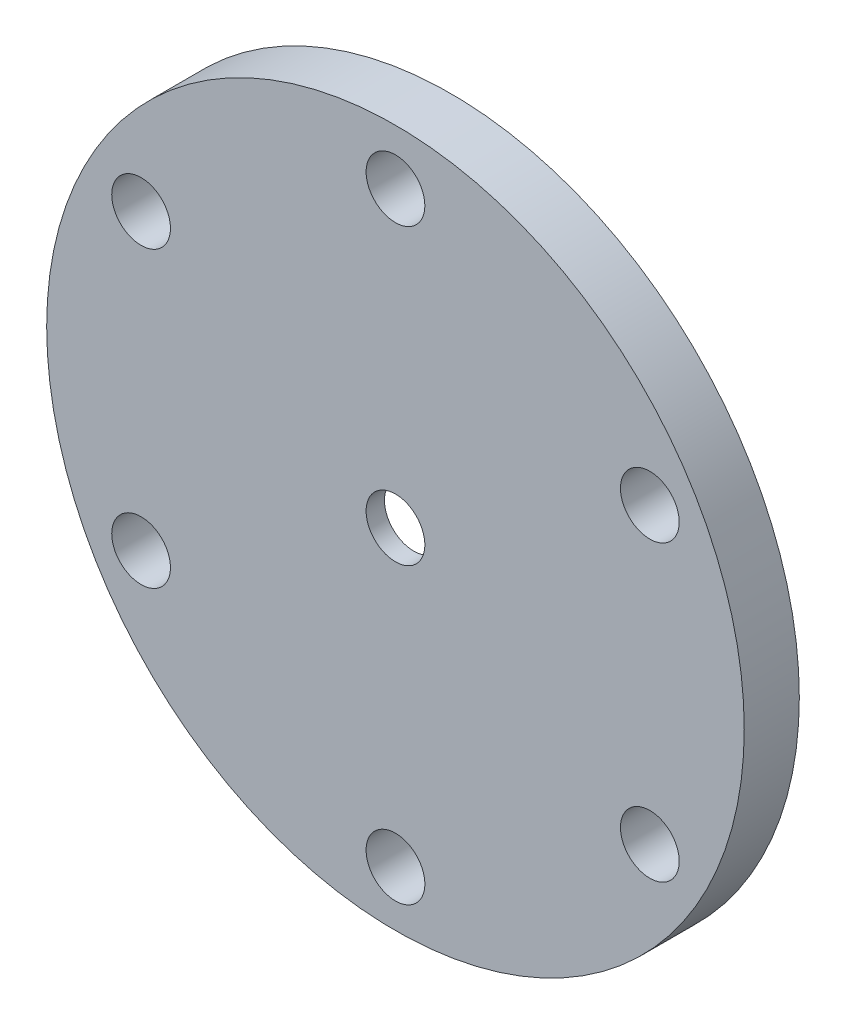
ISO-10303-21;
HEADER;
FILE_DESCRIPTION(('STEP AP214'),'2;1');
FILE_NAME('part.step','',(''),(''),'','','');
FILE_SCHEMA(('AUTOMOTIVE_DESIGN { 1 0 10303 214 1 1 1 1 }'));
ENDSEC;
DATA;
#1=APPLICATION_CONTEXT('core data for automotive mechanical design processes');
#2=APPLICATION_PROTOCOL_DEFINITION('international standard','automotive_design',2000,#1);
#3=PRODUCT_CONTEXT('',#1,'mechanical');
#4=PRODUCT('Part','Part','',(#3));
#5=PRODUCT_RELATED_PRODUCT_CATEGORY('part','',(#4));
#6=PRODUCT_DEFINITION_FORMATION('','',#4);
#7=PRODUCT_DEFINITION_CONTEXT('part definition',#1,'design');
#8=PRODUCT_DEFINITION('design','',#6,#7);
#9=PRODUCT_DEFINITION_SHAPE('','',#8);
#10=(LENGTH_UNIT() NAMED_UNIT(*) SI_UNIT(.MILLI.,.METRE.));
#11=(NAMED_UNIT(*) PLANE_ANGLE_UNIT() SI_UNIT($,.RADIAN.));
#12=(NAMED_UNIT(*) SI_UNIT($,.STERADIAN.) SOLID_ANGLE_UNIT());
#13=UNCERTAINTY_MEASURE_WITH_UNIT(LENGTH_MEASURE(1.E-05),#10,'distance_accuracy_value','');
#14=(GEOMETRIC_REPRESENTATION_CONTEXT(3) GLOBAL_UNCERTAINTY_ASSIGNED_CONTEXT((#13)) GLOBAL_UNIT_ASSIGNED_CONTEXT((#10,
#11,#12)) REPRESENTATION_CONTEXT('',''));
#15=CARTESIAN_POINT('',(0.,0.,0.));
#16=DIRECTION('',(0.,0.,1.));
#17=DIRECTION('',(1.,0.,0.));
#18=AXIS2_PLACEMENT_3D('',#15,#16,#17);
#19=CARTESIAN_POINT('',(0.,0.,83.1));
#20=DIRECTION('',(0.,0.,-1.));
#21=DIRECTION('',(1.,0.,0.));
#22=AXIS2_PLACEMENT_3D('',#19,#20,#21);
#23=CYLINDRICAL_SURFACE('',#22,12.);
#24=CARTESIAN_POINT('',(0.,0.,81.1));
#25=DIRECTION('',(0.,0.,1.));
#26=DIRECTION('',(1.,0.,0.));
#27=AXIS2_PLACEMENT_3D('',#24,#25,#26);
#28=CIRCLE('',#27,12.);
#29=CARTESIAN_POINT('',(-12.,0.,81.1));
#30=VERTEX_POINT('',#29);
#31=EDGE_CURVE('E40',#30,#30,#28,.T.);
#32=ORIENTED_EDGE('',*,*,#31,.F.);
#33=DIRECTION('',(0.,0.,1.));
#34=VECTOR('',#33,1.);
#35=CARTESIAN_POINT('',(-12.,0.,83.1));
#36=LINE('',#35,#34);
#37=CARTESIAN_POINT('',(-12.,0.,83.1));
#38=VERTEX_POINT('',#37);
#39=EDGE_CURVE('E11',#30,#38,#36,.T.);
#40=ORIENTED_EDGE('',*,*,#39,.T.);
#41=CARTESIAN_POINT('',(0.,0.,83.1));
#42=DIRECTION('',(0.,0.,-1.));
#43=DIRECTION('',(1.,0.,0.));
#44=AXIS2_PLACEMENT_3D('',#41,#42,#43);
#45=CIRCLE('',#44,12.);
#46=EDGE_CURVE('E208',#38,#38,#45,.T.);
#47=ORIENTED_EDGE('',*,*,#46,.F.);
#48=ORIENTED_EDGE('',*,*,#39,.F.);
#49=EDGE_LOOP('',(#32,#40,#47,#48));
#50=FACE_BOUND('',#49,.T.);
#51=ADVANCED_FACE('F16',(#50),#23,.F.);
#52=CARTESIAN_POINT('',(0.,0.,81.1));
#53=DIRECTION('',(0.,0.,1.));
#54=DIRECTION('',(1.,0.,0.));
#55=AXIS2_PLACEMENT_3D('',#52,#53,#54);
#56=PLANE('',#55);
#57=CARTESIAN_POINT('',(0.,0.,81.1));
#58=DIRECTION('',(0.,0.,-1.));
#59=DIRECTION('',(1.,0.,0.));
#60=AXIS2_PLACEMENT_3D('',#57,#58,#59);
#61=CIRCLE('',#60,19.);
#62=CARTESIAN_POINT('',(-19.,0.,81.1));
#63=VERTEX_POINT('',#62);
#64=EDGE_CURVE('E27',#63,#63,#61,.T.);
#65=ORIENTED_EDGE('',*,*,#64,.T.);
#66=EDGE_LOOP('',(#65));
#67=FACE_BOUND('',#66,.T.);
#68=CARTESIAN_POINT('',(-13.8564066670276,-8.00000011920929,81.1));
#69=DIRECTION('',(0.,0.,1.));
#70=DIRECTION('',(1.,0.,0.));
#71=AXIS2_PLACEMENT_3D('',#68,#69,#70);
#72=CIRCLE('',#71,1.6);
#73=CARTESIAN_POINT('',(-15.4564066670276,-8.00000011920929,81.1));
#74=VERTEX_POINT('',#73);
#75=EDGE_CURVE('E176',#74,#74,#72,.T.);
#76=ORIENTED_EDGE('',*,*,#75,.T.);
#77=EDGE_LOOP('',(#76));
#78=FACE_BOUND('',#77,.T.);
#79=CARTESIAN_POINT('',(-13.8564066670276,8.00000011920929,81.1));
#80=DIRECTION('',(0.,0.,1.));
#81=DIRECTION('',(1.,0.,0.));
#82=AXIS2_PLACEMENT_3D('',#79,#80,#81);
#83=CIRCLE('',#82,1.6);
#84=CARTESIAN_POINT('',(-15.4564066670276,8.00000011920929,81.1));
#85=VERTEX_POINT('',#84);
#86=EDGE_CURVE('E180',#85,#85,#83,.T.);
#87=ORIENTED_EDGE('',*,*,#86,.T.);
#88=EDGE_LOOP('',(#87));
#89=FACE_BOUND('',#88,.T.);
#90=CARTESIAN_POINT('',(13.8564066670276,8.00000011920929,81.1));
#91=DIRECTION('',(0.,0.,1.));
#92=DIRECTION('',(1.,0.,0.));
#93=AXIS2_PLACEMENT_3D('',#90,#91,#92);
#94=CIRCLE('',#93,1.6);
#95=CARTESIAN_POINT('',(12.2564066670276,8.00000011920929,81.1));
#96=VERTEX_POINT('',#95);
#97=EDGE_CURVE('E175',#96,#96,#94,.T.);
#98=ORIENTED_EDGE('',*,*,#97,.T.);
#99=EDGE_LOOP('',(#98));
#100=FACE_BOUND('',#99,.T.);
#101=CARTESIAN_POINT('',(13.8564066670276,-8.00000011920929,81.1));
#102=DIRECTION('',(0.,0.,1.));
#103=DIRECTION('',(1.,0.,0.));
#104=AXIS2_PLACEMENT_3D('',#101,#102,#103);
#105=CIRCLE('',#104,1.6);
#106=CARTESIAN_POINT('',(12.2564066670276,-8.00000011920929,81.1));
#107=VERTEX_POINT('',#106);
#108=EDGE_CURVE('E171',#107,#107,#105,.T.);
#109=ORIENTED_EDGE('',*,*,#108,.T.);
#110=EDGE_LOOP('',(#109));
#111=FACE_BOUND('',#110,.T.);
#112=ORIENTED_EDGE('',*,*,#31,.T.);
#113=EDGE_LOOP('',(#112));
#114=FACE_BOUND('',#113,.T.);
#115=CARTESIAN_POINT('',(0.,16.0000002384186,81.1));
#116=DIRECTION('',(0.,0.,1.));
#117=DIRECTION('',(1.,0.,0.));
#118=AXIS2_PLACEMENT_3D('',#115,#116,#117);
#119=CIRCLE('',#118,1.6);
#120=CARTESIAN_POINT('',(-1.6,16.0000002384186,81.1));
#121=VERTEX_POINT('',#120);
#122=EDGE_CURVE('E145',#121,#121,#119,.T.);
#123=ORIENTED_EDGE('',*,*,#122,.T.);
#124=EDGE_LOOP('',(#123));
#125=FACE_BOUND('',#124,.T.);
#126=CARTESIAN_POINT('',(0.,-16.0000002384186,81.1));
#127=DIRECTION('',(0.,0.,1.));
#128=DIRECTION('',(1.,0.,0.));
#129=AXIS2_PLACEMENT_3D('',#126,#127,#128);
#130=CIRCLE('',#129,1.6);
#131=CARTESIAN_POINT('',(-1.6,-16.0000002384186,81.1));
#132=VERTEX_POINT('',#131);
#133=EDGE_CURVE('E148',#132,#132,#130,.T.);
#134=ORIENTED_EDGE('',*,*,#133,.T.);
#135=EDGE_LOOP('',(#134));
#136=FACE_BOUND('',#135,.T.);
#137=ADVANCED_FACE('F219',(#67,#78,#89,#100,#111,#114,#125,#136),#56,.F.);
#138=CARTESIAN_POINT('',(-13.8564066670276,8.00000011920929,83.1));
#139=DIRECTION('',(0.,0.,1.));
#140=DIRECTION('',(1.,0.,0.));
#141=AXIS2_PLACEMENT_3D('',#138,#139,#140);
#142=CYLINDRICAL_SURFACE('',#141,1.6);
#143=CARTESIAN_POINT('',(-13.8564066670276,8.00000011920929,84.1));
#144=DIRECTION('',(0.,0.,-1.));
#145=DIRECTION('',(1.,0.,0.));
#146=AXIS2_PLACEMENT_3D('',#143,#144,#145);
#147=CIRCLE('',#146,1.6);
#148=CARTESIAN_POINT('',(-15.4564066670276,8.00000011920929,84.1));
#149=VERTEX_POINT('',#148);
#150=EDGE_CURVE('E114',#149,#149,#147,.T.);
#151=ORIENTED_EDGE('',*,*,#150,.F.);
#152=DIRECTION('',(0.,0.,-1.));
#153=VECTOR('',#152,1.);
#154=CARTESIAN_POINT('',(-15.4564066670276,8.00000011920929,83.1));
#155=LINE('',#154,#153);
#156=EDGE_CURVE('E144',#149,#85,#155,.T.);
#157=ORIENTED_EDGE('',*,*,#156,.T.);
#158=ORIENTED_EDGE('',*,*,#86,.F.);
#159=ORIENTED_EDGE('',*,*,#156,.F.);
#160=EDGE_LOOP('',(#151,#157,#158,#159));
#161=FACE_BOUND('',#160,.T.);
#162=ADVANCED_FACE('F221',(#161),#142,.F.);
#163=CARTESIAN_POINT('',(0.,16.0000002384186,83.1));
#164=DIRECTION('',(0.,0.,1.));
#165=DIRECTION('',(1.,0.,0.));
#166=AXIS2_PLACEMENT_3D('',#163,#164,#165);
#167=CYLINDRICAL_SURFACE('',#166,1.6);
#168=CARTESIAN_POINT('',(0.,16.0000002384186,84.1));
#169=DIRECTION('',(0.,0.,-1.));
#170=DIRECTION('',(1.,0.,0.));
#171=AXIS2_PLACEMENT_3D('',#168,#169,#170);
#172=CIRCLE('',#171,1.6);
#173=CARTESIAN_POINT('',(1.6,16.0000002384186,84.1));
#174=VERTEX_POINT('',#173);
#175=CARTESIAN_POINT('',(-1.6,16.0000002384186,84.1));
#176=VERTEX_POINT('',#175);
#177=EDGE_CURVE('E102',#174,#176,#172,.T.);
#178=ORIENTED_EDGE('',*,*,#177,.F.);
#179=CARTESIAN_POINT('',(0.,16.0000002384186,84.1));
#180=DIRECTION('',(0.,0.,-1.));
#181=DIRECTION('',(1.,0.,0.));
#182=AXIS2_PLACEMENT_3D('',#179,#180,#181);
#183=CIRCLE('',#182,1.6);
#184=EDGE_CURVE('E140',#176,#174,#183,.T.);
#185=ORIENTED_EDGE('',*,*,#184,.F.);
#186=DIRECTION('',(0.,0.,-1.));
#187=VECTOR('',#186,1.);
#188=CARTESIAN_POINT('',(-1.6,16.0000002384186,83.1));
#189=LINE('',#188,#187);
#190=EDGE_CURVE('E154',#176,#121,#189,.T.);
#191=ORIENTED_EDGE('',*,*,#190,.T.);
#192=ORIENTED_EDGE('',*,*,#122,.F.);
#193=ORIENTED_EDGE('',*,*,#190,.F.);
#194=EDGE_LOOP('',(#178,#185,#191,#192,#193));
#195=FACE_BOUND('',#194,.T.);
#196=ADVANCED_FACE('F227',(#195),#167,.F.);
#197=CARTESIAN_POINT('',(13.8564066670276,8.00000011920929,83.1));
#198=DIRECTION('',(0.,0.,1.));
#199=DIRECTION('',(1.,0.,0.));
#200=AXIS2_PLACEMENT_3D('',#197,#198,#199);
#201=CYLINDRICAL_SURFACE('',#200,1.6);
#202=CARTESIAN_POINT('',(13.8564066670276,8.00000011920929,84.1));
#203=DIRECTION('',(0.,0.,-1.));
#204=DIRECTION('',(1.,0.,0.));
#205=AXIS2_PLACEMENT_3D('',#202,#203,#204);
#206=CIRCLE('',#205,1.6);
#207=CARTESIAN_POINT('',(12.2564066670276,8.00000011920929,84.1));
#208=VERTEX_POINT('',#207);
#209=EDGE_CURVE('E125',#208,#208,#206,.T.);
#210=ORIENTED_EDGE('',*,*,#209,.F.);
#211=DIRECTION('',(0.,0.,-1.));
#212=VECTOR('',#211,1.);
#213=CARTESIAN_POINT('',(12.2564066670276,8.00000011920929,83.1));
#214=LINE('',#213,#212);
#215=EDGE_CURVE('E127',#208,#96,#214,.T.);
#216=ORIENTED_EDGE('',*,*,#215,.T.);
#217=ORIENTED_EDGE('',*,*,#97,.F.);
#218=ORIENTED_EDGE('',*,*,#215,.F.);
#219=EDGE_LOOP('',(#210,#216,#217,#218));
#220=FACE_BOUND('',#219,.T.);
#221=ADVANCED_FACE('F126',(#220),#201,.F.);
#222=CARTESIAN_POINT('',(13.8564066670276,-8.00000011920929,83.1));
#223=DIRECTION('',(0.,0.,1.));
#224=DIRECTION('',(1.,0.,0.));
#225=AXIS2_PLACEMENT_3D('',#222,#223,#224);
#226=CYLINDRICAL_SURFACE('',#225,1.6);
#227=CARTESIAN_POINT('',(13.8564066670276,-8.00000011920929,84.1));
#228=DIRECTION('',(0.,0.,-1.));
#229=DIRECTION('',(1.,0.,0.));
#230=AXIS2_PLACEMENT_3D('',#227,#228,#229);
#231=CIRCLE('',#230,1.6);
#232=CARTESIAN_POINT('',(12.2564066670276,-8.00000011920929,84.1));
#233=VERTEX_POINT('',#232);
#234=EDGE_CURVE('E130',#233,#233,#231,.T.);
#235=ORIENTED_EDGE('',*,*,#234,.F.);
#236=DIRECTION('',(0.,0.,-1.));
#237=VECTOR('',#236,1.);
#238=CARTESIAN_POINT('',(12.2564066670276,-8.00000011920929,83.1));
#239=LINE('',#238,#237);
#240=EDGE_CURVE('E149',#233,#107,#239,.T.);
#241=ORIENTED_EDGE('',*,*,#240,.T.);
#242=ORIENTED_EDGE('',*,*,#108,.F.);
#243=ORIENTED_EDGE('',*,*,#240,.F.);
#244=EDGE_LOOP('',(#235,#241,#242,#243));
#245=FACE_BOUND('',#244,.T.);
#246=ADVANCED_FACE('F247',(#245),#226,.F.);
#247=CARTESIAN_POINT('',(0.,-16.0000002384186,83.1));
#248=DIRECTION('',(0.,0.,1.));
#249=DIRECTION('',(1.,0.,0.));
#250=AXIS2_PLACEMENT_3D('',#247,#248,#249);
#251=CYLINDRICAL_SURFACE('',#250,1.6);
#252=CARTESIAN_POINT('',(0.,-16.0000002384186,84.1));
#253=DIRECTION('',(0.,0.,-1.));
#254=DIRECTION('',(1.,0.,0.));
#255=AXIS2_PLACEMENT_3D('',#252,#253,#254);
#256=CIRCLE('',#255,1.6);
#257=CARTESIAN_POINT('',(-1.6,-16.0000002384186,84.1));
#258=VERTEX_POINT('',#257);
#259=EDGE_CURVE('E137',#258,#258,#256,.T.);
#260=ORIENTED_EDGE('',*,*,#259,.F.);
#261=DIRECTION('',(0.,0.,-1.));
#262=VECTOR('',#261,1.);
#263=CARTESIAN_POINT('',(-1.6,-16.0000002384186,83.1));
#264=LINE('',#263,#262);
#265=EDGE_CURVE('E153',#258,#132,#264,.T.);
#266=ORIENTED_EDGE('',*,*,#265,.T.);
#267=ORIENTED_EDGE('',*,*,#133,.F.);
#268=ORIENTED_EDGE('',*,*,#265,.F.);
#269=EDGE_LOOP('',(#260,#266,#267,#268));
#270=FACE_BOUND('',#269,.T.);
#271=ADVANCED_FACE('F249',(#270),#251,.F.);
#272=CARTESIAN_POINT('',(0.,0.,83.1));
#273=DIRECTION('',(0.,0.,1.));
#274=DIRECTION('',(1.,0.,0.));
#275=AXIS2_PLACEMENT_3D('',#272,#273,#274);
#276=CYLINDRICAL_SURFACE('',#275,1.6);
#277=CARTESIAN_POINT('',(0.,0.,84.1));
#278=DIRECTION('',(0.,0.,-1.));
#279=DIRECTION('',(1.,0.,0.));
#280=AXIS2_PLACEMENT_3D('',#277,#278,#279);
#281=CIRCLE('',#280,1.6);
#282=CARTESIAN_POINT('',(-1.6,0.,84.1));
#283=VERTEX_POINT('',#282);
#284=EDGE_CURVE('E164',#283,#283,#281,.T.);
#285=ORIENTED_EDGE('',*,*,#284,.F.);
#286=DIRECTION('',(0.,0.,-1.));
#287=VECTOR('',#286,1.);
#288=CARTESIAN_POINT('',(-1.6,0.,83.1));
#289=LINE('',#288,#287);
#290=CARTESIAN_POINT('',(-1.6,0.,83.1));
#291=VERTEX_POINT('',#290);
#292=EDGE_CURVE('E190',#283,#291,#289,.T.);
#293=ORIENTED_EDGE('',*,*,#292,.T.);
#294=CARTESIAN_POINT('',(0.,0.,83.1));
#295=DIRECTION('',(0.,0.,-1.));
#296=DIRECTION('',(1.,0.,0.));
#297=AXIS2_PLACEMENT_3D('',#294,#295,#296);
#298=CIRCLE('',#297,1.6);
#299=EDGE_CURVE('E162',#291,#291,#298,.T.);
#300=ORIENTED_EDGE('',*,*,#299,.T.);
#301=ORIENTED_EDGE('',*,*,#292,.F.);
#302=EDGE_LOOP('',(#285,#293,#300,#301));
#303=FACE_BOUND('',#302,.T.);
#304=ADVANCED_FACE('F252',(#303),#276,.F.);
#305=CARTESIAN_POINT('',(-13.8564066670276,-8.00000011920929,83.1));
#306=DIRECTION('',(0.,0.,1.));
#307=DIRECTION('',(1.,0.,0.));
#308=AXIS2_PLACEMENT_3D('',#305,#306,#307);
#309=CYLINDRICAL_SURFACE('',#308,1.6);
#310=CARTESIAN_POINT('',(-13.8564066670276,-8.00000011920929,84.1));
#311=DIRECTION('',(0.,0.,-1.));
#312=DIRECTION('',(1.,0.,0.));
#313=AXIS2_PLACEMENT_3D('',#310,#311,#312);
#314=CIRCLE('',#313,1.6);
#315=CARTESIAN_POINT('',(-15.4564066670276,-8.00000011920929,84.1));
#316=VERTEX_POINT('',#315);
#317=EDGE_CURVE('E20',#316,#316,#314,.T.);
#318=ORIENTED_EDGE('',*,*,#317,.F.);
#319=DIRECTION('',(0.,0.,-1.));
#320=VECTOR('',#319,1.);
#321=CARTESIAN_POINT('',(-15.4564066670276,-8.00000011920929,83.1));
#322=LINE('',#321,#320);
#323=EDGE_CURVE('E158',#316,#74,#322,.T.);
#324=ORIENTED_EDGE('',*,*,#323,.T.);
#325=ORIENTED_EDGE('',*,*,#75,.F.);
#326=ORIENTED_EDGE('',*,*,#323,.F.);
#327=EDGE_LOOP('',(#318,#324,#325,#326));
#328=FACE_BOUND('',#327,.T.);
#329=ADVANCED_FACE('F257',(#328),#309,.F.);
#330=CARTESIAN_POINT('',(0.,0.,83.1));
#331=DIRECTION('',(0.,0.,1.));
#332=DIRECTION('',(1.,0.,0.));
#333=AXIS2_PLACEMENT_3D('',#330,#331,#332);
#334=CYLINDRICAL_SURFACE('',#333,19.);
#335=CARTESIAN_POINT('',(0.,0.,84.1));
#336=DIRECTION('',(0.,0.,1.));
#337=DIRECTION('',(1.,0.,0.));
#338=AXIS2_PLACEMENT_3D('',#335,#336,#337);
#339=CIRCLE('',#338,19.);
#340=CARTESIAN_POINT('',(-19.,0.,84.1));
#341=VERTEX_POINT('',#340);
#342=EDGE_CURVE('E214',#341,#341,#339,.T.);
#343=ORIENTED_EDGE('',*,*,#342,.F.);
#344=DIRECTION('',(0.,0.,-1.));
#345=VECTOR('',#344,1.);
#346=CARTESIAN_POINT('',(-19.,0.,83.1));
#347=LINE('',#346,#345);
#348=EDGE_CURVE('E163',#341,#63,#347,.T.);
#349=ORIENTED_EDGE('',*,*,#348,.T.);
#350=ORIENTED_EDGE('',*,*,#64,.F.);
#351=ORIENTED_EDGE('',*,*,#348,.F.);
#352=EDGE_LOOP('',(#343,#349,#350,#351));
#353=FACE_BOUND('',#352,.T.);
#354=ADVANCED_FACE('F18',(#353),#334,.T.);
#355=CARTESIAN_POINT('',(0.,0.,84.1));
#356=DIRECTION('',(0.,0.,1.));
#357=DIRECTION('',(1.,0.,0.));
#358=AXIS2_PLACEMENT_3D('',#355,#356,#357);
#359=PLANE('',#358);
#360=ORIENTED_EDGE('',*,*,#342,.T.);
#361=EDGE_LOOP('',(#360));
#362=FACE_BOUND('',#361,.T.);
#363=ORIENTED_EDGE('',*,*,#317,.T.);
#364=EDGE_LOOP('',(#363));
#365=FACE_BOUND('',#364,.T.);
#366=ORIENTED_EDGE('',*,*,#284,.T.);
#367=EDGE_LOOP('',(#366));
#368=FACE_BOUND('',#367,.T.);
#369=ORIENTED_EDGE('',*,*,#259,.T.);
#370=EDGE_LOOP('',(#369));
#371=FACE_BOUND('',#370,.T.);
#372=ORIENTED_EDGE('',*,*,#234,.T.);
#373=EDGE_LOOP('',(#372));
#374=FACE_BOUND('',#373,.T.);
#375=ORIENTED_EDGE('',*,*,#209,.T.);
#376=EDGE_LOOP('',(#375));
#377=FACE_BOUND('',#376,.T.);
#378=ORIENTED_EDGE('',*,*,#177,.T.);
#379=ORIENTED_EDGE('',*,*,#184,.T.);
#380=EDGE_LOOP('',(#378,#379));
#381=FACE_BOUND('',#380,.T.);
#382=ORIENTED_EDGE('',*,*,#150,.T.);
#383=EDGE_LOOP('',(#382));
#384=FACE_BOUND('',#383,.T.);
#385=ADVANCED_FACE('F260',(#362,#365,#368,#371,#374,#377,#381,#384),#359,.T.);
#386=CARTESIAN_POINT('',(0.,0.,83.1));
#387=DIRECTION('',(0.,0.,1.));
#388=DIRECTION('',(1.,0.,0.));
#389=AXIS2_PLACEMENT_3D('',#386,#387,#388);
#390=PLANE('',#389);
#391=ORIENTED_EDGE('',*,*,#46,.T.);
#392=EDGE_LOOP('',(#391));
#393=FACE_BOUND('',#392,.T.);
#394=ORIENTED_EDGE('',*,*,#299,.F.);
#395=EDGE_LOOP('',(#394));
#396=FACE_BOUND('',#395,.T.);
#397=ADVANCED_FACE('F263',(#393,#396),#390,.F.);
#398=CLOSED_SHELL('',(#51,#137,#162,#196,#221,#246,#271,#304,#329,#354,#385,#397));
#399=MANIFOLD_SOLID_BREP('B1',#398);
#400=ADVANCED_BREP_SHAPE_REPRESENTATION('',(#18,#399),#14);
#401=SHAPE_DEFINITION_REPRESENTATION(#9,#400);
ENDSEC;
END-ISO-10303-21;
